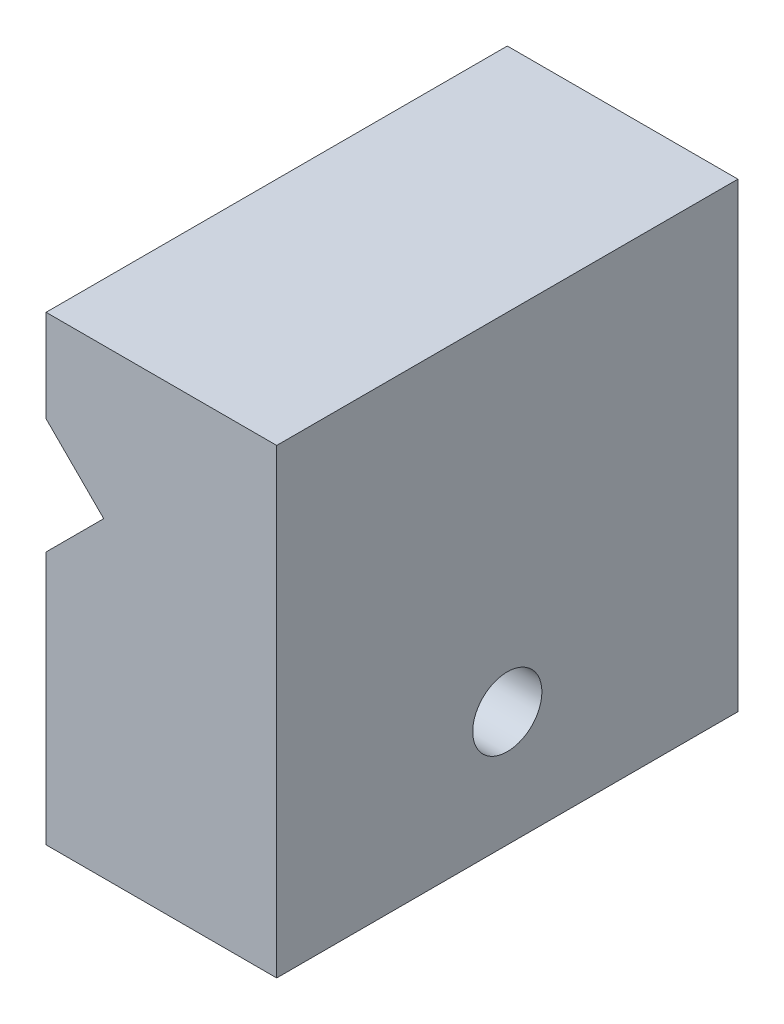
ISO-10303-21;
HEADER;
FILE_DESCRIPTION(('STEP AP214'),'2;1');
FILE_NAME('part.step','',(''),(''),'','','');
FILE_SCHEMA(('AUTOMOTIVE_DESIGN { 1 0 10303 214 1 1 1 1 }'));
ENDSEC;
DATA;
#1=APPLICATION_CONTEXT('core data for automotive mechanical design processes');
#2=APPLICATION_PROTOCOL_DEFINITION('international standard','automotive_design',2000,#1);
#3=PRODUCT_CONTEXT('',#1,'mechanical');
#4=PRODUCT('Part','Part','',(#3));
#5=PRODUCT_RELATED_PRODUCT_CATEGORY('part','',(#4));
#6=PRODUCT_DEFINITION_FORMATION('','',#4);
#7=PRODUCT_DEFINITION_CONTEXT('part definition',#1,'design');
#8=PRODUCT_DEFINITION('design','',#6,#7);
#9=PRODUCT_DEFINITION_SHAPE('','',#8);
#10=(LENGTH_UNIT() NAMED_UNIT(*) SI_UNIT(.MILLI.,.METRE.));
#11=(NAMED_UNIT(*) PLANE_ANGLE_UNIT() SI_UNIT($,.RADIAN.));
#12=(NAMED_UNIT(*) SI_UNIT($,.STERADIAN.) SOLID_ANGLE_UNIT());
#13=UNCERTAINTY_MEASURE_WITH_UNIT(LENGTH_MEASURE(1.E-05),#10,'distance_accuracy_value','');
#14=(GEOMETRIC_REPRESENTATION_CONTEXT(3) GLOBAL_UNCERTAINTY_ASSIGNED_CONTEXT((#13)) GLOBAL_UNIT_ASSIGNED_CONTEXT((#10,
#11,#12)) REPRESENTATION_CONTEXT('',''));
#15=CARTESIAN_POINT('',(0.,0.,0.));
#16=DIRECTION('',(0.,0.,1.));
#17=DIRECTION('',(1.,0.,0.));
#18=AXIS2_PLACEMENT_3D('',#15,#16,#17);
#19=CARTESIAN_POINT('',(-5.,-10.,20.));
#20=DIRECTION('',(1.,0.,0.));
#21=DIRECTION('',(0.,0.,-1.));
#22=AXIS2_PLACEMENT_3D('',#19,#20,#21);
#23=PLANE('',#22);
#24=DIRECTION('',(0.,-1.,0.));
#25=VECTOR('',#24,1.);
#26=CARTESIAN_POINT('',(-5.,-10.,0.));
#27=LINE('',#26,#25);
#28=CARTESIAN_POINT('',(-5.,9.99999999999999,0.));
#29=VERTEX_POINT('',#28);
#30=CARTESIAN_POINT('',(-5.,5.99999999999999,0.));
#31=VERTEX_POINT('',#30);
#32=EDGE_CURVE('E98',#29,#31,#27,.T.);
#33=ORIENTED_EDGE('',*,*,#32,.T.);
#34=DIRECTION('',(0.,0.,-1.));
#35=VECTOR('',#34,1.);
#36=CARTESIAN_POINT('',(-5.,5.99999999999999,82.5));
#37=LINE('',#36,#35);
#38=CARTESIAN_POINT('',(-5.,5.99999999999999,20.));
#39=VERTEX_POINT('',#38);
#40=EDGE_CURVE('E106',#39,#31,#37,.T.);
#41=ORIENTED_EDGE('',*,*,#40,.F.);
#42=DIRECTION('',(0.,-1.,0.));
#43=VECTOR('',#42,1.);
#44=CARTESIAN_POINT('',(-5.,-10.,20.));
#45=LINE('',#44,#43);
#46=CARTESIAN_POINT('',(-5.,9.99999999999999,20.));
#47=VERTEX_POINT('',#46);
#48=EDGE_CURVE('E134',#47,#39,#45,.T.);
#49=ORIENTED_EDGE('',*,*,#48,.F.);
#50=DIRECTION('',(0.,0.,-1.));
#51=VECTOR('',#50,1.);
#52=CARTESIAN_POINT('',(-5.,9.99999999999999,20.));
#53=LINE('',#52,#51);
#54=EDGE_CURVE('E115',#47,#29,#53,.T.);
#55=ORIENTED_EDGE('',*,*,#54,.T.);
#56=EDGE_LOOP('',(#33,#41,#49,#55));
#57=FACE_BOUND('',#56,.T.);
#58=ADVANCED_FACE('F31',(#57),#23,.F.);
#59=CARTESIAN_POINT('',(5.,-10.,20.));
#60=DIRECTION('',(-1.,0.,0.));
#61=DIRECTION('',(0.,0.,1.));
#62=AXIS2_PLACEMENT_3D('',#59,#60,#61);
#63=PLANE('',#62);
#64=CARTESIAN_POINT('',(5.,-5.00000000000001,10.));
#65=DIRECTION('',(1.,0.,0.));
#66=DIRECTION('',(0.,0.,-1.));
#67=AXIS2_PLACEMENT_3D('',#64,#65,#66);
#68=CIRCLE('',#67,1.5);
#69=CARTESIAN_POINT('',(5.,-5.00000000000001,8.5));
#70=VERTEX_POINT('',#69);
#71=EDGE_CURVE('E145',#70,#70,#68,.T.);
#72=ORIENTED_EDGE('',*,*,#71,.F.);
#73=EDGE_LOOP('',(#72));
#74=FACE_BOUND('',#73,.T.);
#75=DIRECTION('',(0.,1.,0.));
#76=VECTOR('',#75,1.);
#77=CARTESIAN_POINT('',(5.,-10.,0.));
#78=LINE('',#77,#76);
#79=CARTESIAN_POINT('',(5.,-10.,0.));
#80=VERTEX_POINT('',#79);
#81=CARTESIAN_POINT('',(5.,9.99999999999999,0.));
#82=VERTEX_POINT('',#81);
#83=EDGE_CURVE('E130',#80,#82,#78,.T.);
#84=ORIENTED_EDGE('',*,*,#83,.T.);
#85=DIRECTION('',(0.,0.,-1.));
#86=VECTOR('',#85,1.);
#87=CARTESIAN_POINT('',(5.,9.99999999999999,20.));
#88=LINE('',#87,#86);
#89=CARTESIAN_POINT('',(5.,9.99999999999999,20.));
#90=VERTEX_POINT('',#89);
#91=EDGE_CURVE('E112',#90,#82,#88,.T.);
#92=ORIENTED_EDGE('',*,*,#91,.F.);
#93=DIRECTION('',(0.,1.,0.));
#94=VECTOR('',#93,1.);
#95=CARTESIAN_POINT('',(5.,-10.,20.));
#96=LINE('',#95,#94);
#97=CARTESIAN_POINT('',(5.,-10.,20.));
#98=VERTEX_POINT('',#97);
#99=EDGE_CURVE('E126',#98,#90,#96,.T.);
#100=ORIENTED_EDGE('',*,*,#99,.F.);
#101=DIRECTION('',(0.,0.,-1.));
#102=VECTOR('',#101,1.);
#103=CARTESIAN_POINT('',(5.,-10.,20.));
#104=LINE('',#103,#102);
#105=EDGE_CURVE('E122',#98,#80,#104,.T.);
#106=ORIENTED_EDGE('',*,*,#105,.T.);
#107=EDGE_LOOP('',(#84,#92,#100,#106));
#108=FACE_BOUND('',#107,.T.);
#109=ADVANCED_FACE('F33',(#74,#108),#63,.F.);
#110=CARTESIAN_POINT('',(-5.,9.99999999999999,20.));
#111=DIRECTION('',(0.,-1.,0.));
#112=DIRECTION('',(0.,0.,-1.));
#113=AXIS2_PLACEMENT_3D('',#110,#111,#112);
#114=PLANE('',#113);
#115=DIRECTION('',(-1.,0.,0.));
#116=VECTOR('',#115,1.);
#117=CARTESIAN_POINT('',(-5.,9.99999999999999,0.));
#118=LINE('',#117,#116);
#119=EDGE_CURVE('E99',#82,#29,#118,.T.);
#120=ORIENTED_EDGE('',*,*,#119,.T.);
#121=ORIENTED_EDGE('',*,*,#54,.F.);
#122=DIRECTION('',(-1.,0.,0.));
#123=VECTOR('',#122,1.);
#124=CARTESIAN_POINT('',(-5.,9.99999999999999,20.));
#125=LINE('',#124,#123);
#126=EDGE_CURVE('E136',#90,#47,#125,.T.);
#127=ORIENTED_EDGE('',*,*,#126,.F.);
#128=ORIENTED_EDGE('',*,*,#91,.T.);
#129=EDGE_LOOP('',(#120,#121,#127,#128));
#130=FACE_BOUND('',#129,.T.);
#131=ADVANCED_FACE('F167',(#130),#114,.F.);
#132=CARTESIAN_POINT('',(-5.,-5.00000000000001,10.));
#133=DIRECTION('',(1.,0.,0.));
#134=DIRECTION('',(0.,0.,-1.));
#135=AXIS2_PLACEMENT_3D('',#132,#133,#134);
#136=CIRCLE('',#135,1.5);
#137=CARTESIAN_POINT('',(-5.,-5.00000000000001,8.5));
#138=VERTEX_POINT('',#137);
#139=EDGE_CURVE('E35',#138,#138,#136,.T.);
#140=ORIENTED_EDGE('',*,*,#139,.T.);
#141=EDGE_LOOP('',(#140));
#142=FACE_BOUND('',#141,.T.);
#143=CARTESIAN_POINT('',(-5.,0.999999999999983,20.));
#144=VERTEX_POINT('',#143);
#145=CARTESIAN_POINT('',(-5.,-10.,20.));
#146=VERTEX_POINT('',#145);
#147=EDGE_CURVE('E104',#144,#146,#45,.T.);
#148=ORIENTED_EDGE('',*,*,#147,.F.);
#149=DIRECTION('',(0.,0.,-1.));
#150=VECTOR('',#149,1.);
#151=CARTESIAN_POINT('',(-5.,0.99999999999999,82.5));
#152=LINE('',#151,#150);
#153=CARTESIAN_POINT('',(-5.,0.99999999999999,0.));
#154=VERTEX_POINT('',#153);
#155=EDGE_CURVE('E102',#144,#154,#152,.T.);
#156=ORIENTED_EDGE('',*,*,#155,.T.);
#157=CARTESIAN_POINT('',(-5.,-10.,0.));
#158=VERTEX_POINT('',#157);
#159=EDGE_CURVE('E89',#154,#158,#27,.T.);
#160=ORIENTED_EDGE('',*,*,#159,.T.);
#161=DIRECTION('',(0.,0.,-1.));
#162=VECTOR('',#161,1.);
#163=CARTESIAN_POINT('',(-5.,-10.,20.));
#164=LINE('',#163,#162);
#165=EDGE_CURVE('E120',#146,#158,#164,.T.);
#166=ORIENTED_EDGE('',*,*,#165,.F.);
#167=EDGE_LOOP('',(#148,#156,#160,#166));
#168=FACE_BOUND('',#167,.T.);
#169=ADVANCED_FACE('F103',(#142,#168),#23,.F.);
#170=CARTESIAN_POINT('',(-5.,-10.,20.));
#171=DIRECTION('',(0.,1.,0.));
#172=DIRECTION('',(0.,0.,1.));
#173=AXIS2_PLACEMENT_3D('',#170,#171,#172);
#174=PLANE('',#173);
#175=DIRECTION('',(1.,0.,0.));
#176=VECTOR('',#175,1.);
#177=CARTESIAN_POINT('',(-5.,-10.,0.));
#178=LINE('',#177,#176);
#179=EDGE_CURVE('E94',#158,#80,#178,.T.);
#180=ORIENTED_EDGE('',*,*,#179,.T.);
#181=ORIENTED_EDGE('',*,*,#105,.F.);
#182=DIRECTION('',(1.,0.,0.));
#183=VECTOR('',#182,1.);
#184=CARTESIAN_POINT('',(-5.,-10.,20.));
#185=LINE('',#184,#183);
#186=EDGE_CURVE('E125',#146,#98,#185,.T.);
#187=ORIENTED_EDGE('',*,*,#186,.F.);
#188=ORIENTED_EDGE('',*,*,#165,.T.);
#189=EDGE_LOOP('',(#180,#181,#187,#188));
#190=FACE_BOUND('',#189,.T.);
#191=ADVANCED_FACE('F171',(#190),#174,.F.);
#192=CARTESIAN_POINT('',(5.,9.99999999999999,20.));
#193=DIRECTION('',(0.,0.,-1.));
#194=DIRECTION('',(-1.,0.,0.));
#195=AXIS2_PLACEMENT_3D('',#192,#193,#194);
#196=PLANE('',#195);
#197=ORIENTED_EDGE('',*,*,#48,.T.);
#198=DIRECTION('',(0.707106781186548,-0.707106781186548,0.));
#199=VECTOR('',#198,1.);
#200=CARTESIAN_POINT('',(-2.,2.99999999999999,20.));
#201=LINE('',#200,#199);
#202=CARTESIAN_POINT('',(-2.5,3.49999999999999,20.));
#203=VERTEX_POINT('',#202);
#204=EDGE_CURVE('E47',#39,#203,#201,.T.);
#205=ORIENTED_EDGE('',*,*,#204,.T.);
#206=DIRECTION('',(-0.707106781186547,-0.707106781186548,0.));
#207=VECTOR('',#206,1.);
#208=CARTESIAN_POINT('',(4.5,10.5,20.));
#209=LINE('',#208,#207);
#210=EDGE_CURVE('E51',#203,#144,#209,.T.);
#211=ORIENTED_EDGE('',*,*,#210,.T.);
#212=ORIENTED_EDGE('',*,*,#147,.T.);
#213=ORIENTED_EDGE('',*,*,#186,.T.);
#214=ORIENTED_EDGE('',*,*,#99,.T.);
#215=ORIENTED_EDGE('',*,*,#126,.T.);
#216=EDGE_LOOP('',(#197,#205,#211,#212,#213,#214,#215));
#217=FACE_BOUND('',#216,.T.);
#218=ADVANCED_FACE('F176',(#217),#196,.F.);
#219=CARTESIAN_POINT('',(5.,9.99999999999999,0.));
#220=DIRECTION('',(0.,0.,-1.));
#221=DIRECTION('',(-1.,0.,0.));
#222=AXIS2_PLACEMENT_3D('',#219,#220,#221);
#223=PLANE('',#222);
#224=DIRECTION('',(0.707106781186548,-0.707106781186548,0.));
#225=VECTOR('',#224,1.);
#226=CARTESIAN_POINT('',(-2.,2.99999999999999,0.));
#227=LINE('',#226,#225);
#228=CARTESIAN_POINT('',(-2.5,3.49999999999999,0.));
#229=VERTEX_POINT('',#228);
#230=EDGE_CURVE('E11',#31,#229,#227,.T.);
#231=ORIENTED_EDGE('',*,*,#230,.F.);
#232=ORIENTED_EDGE('',*,*,#32,.F.);
#233=ORIENTED_EDGE('',*,*,#119,.F.);
#234=ORIENTED_EDGE('',*,*,#83,.F.);
#235=ORIENTED_EDGE('',*,*,#179,.F.);
#236=ORIENTED_EDGE('',*,*,#159,.F.);
#237=DIRECTION('',(-0.707106781186547,-0.707106781186548,0.));
#238=VECTOR('',#237,1.);
#239=CARTESIAN_POINT('',(4.5,10.5,0.));
#240=LINE('',#239,#238);
#241=EDGE_CURVE('E40',#229,#154,#240,.T.);
#242=ORIENTED_EDGE('',*,*,#241,.F.);
#243=EDGE_LOOP('',(#231,#232,#233,#234,#235,#236,#242));
#244=FACE_BOUND('',#243,.T.);
#245=ADVANCED_FACE('F91',(#244),#223,.T.);
#246=CARTESIAN_POINT('',(-5.,5.99999999999999,82.5));
#247=DIRECTION('',(0.707106781186548,0.707106781186548,0.));
#248=DIRECTION('',(-0.707106781186548,0.707106781186548,0.));
#249=AXIS2_PLACEMENT_3D('',#246,#247,#248);
#250=PLANE('',#249);
#251=ORIENTED_EDGE('',*,*,#204,.F.);
#252=ORIENTED_EDGE('',*,*,#40,.T.);
#253=ORIENTED_EDGE('',*,*,#230,.T.);
#254=DIRECTION('',(0.,0.,-1.));
#255=VECTOR('',#254,1.);
#256=CARTESIAN_POINT('',(-2.5,3.49999999999999,82.5));
#257=LINE('',#256,#255);
#258=EDGE_CURVE('E107',#203,#229,#257,.T.);
#259=ORIENTED_EDGE('',*,*,#258,.F.);
#260=EDGE_LOOP('',(#251,#252,#253,#259));
#261=FACE_BOUND('',#260,.T.);
#262=ADVANCED_FACE('F159',(#261),#250,.F.);
#263=CARTESIAN_POINT('',(-2.5,3.49999999999999,82.5));
#264=DIRECTION('',(0.707106781186548,-0.707106781186547,0.));
#265=DIRECTION('',(0.707106781186547,0.707106781186548,0.));
#266=AXIS2_PLACEMENT_3D('',#263,#264,#265);
#267=PLANE('',#266);
#268=ORIENTED_EDGE('',*,*,#210,.F.);
#269=ORIENTED_EDGE('',*,*,#258,.T.);
#270=ORIENTED_EDGE('',*,*,#241,.T.);
#271=ORIENTED_EDGE('',*,*,#155,.F.);
#272=EDGE_LOOP('',(#268,#269,#270,#271));
#273=FACE_BOUND('',#272,.T.);
#274=ADVANCED_FACE('F110',(#273),#267,.F.);
#275=CARTESIAN_POINT('',(-35.,-5.00000000000001,10.));
#276=DIRECTION('',(1.,0.,0.));
#277=DIRECTION('',(0.,0.,-1.));
#278=AXIS2_PLACEMENT_3D('',#275,#276,#277);
#279=CYLINDRICAL_SURFACE('',#278,1.5);
#280=ORIENTED_EDGE('',*,*,#71,.T.);
#281=EDGE_LOOP('',(#280));
#282=FACE_BOUND('',#281,.T.);
#283=ORIENTED_EDGE('',*,*,#139,.F.);
#284=EDGE_LOOP('',(#283));
#285=FACE_BOUND('',#284,.T.);
#286=ADVANCED_FACE('F153',(#282,#285),#279,.F.);
#287=CLOSED_SHELL('',(#58,#109,#131,#169,#191,#218,#245,#262,#274,#286));
#288=MANIFOLD_SOLID_BREP('B2',#287);
#289=ADVANCED_BREP_SHAPE_REPRESENTATION('',(#18,#288),#14);
#290=SHAPE_DEFINITION_REPRESENTATION(#9,#289);
ENDSEC;
END-ISO-10303-21;
